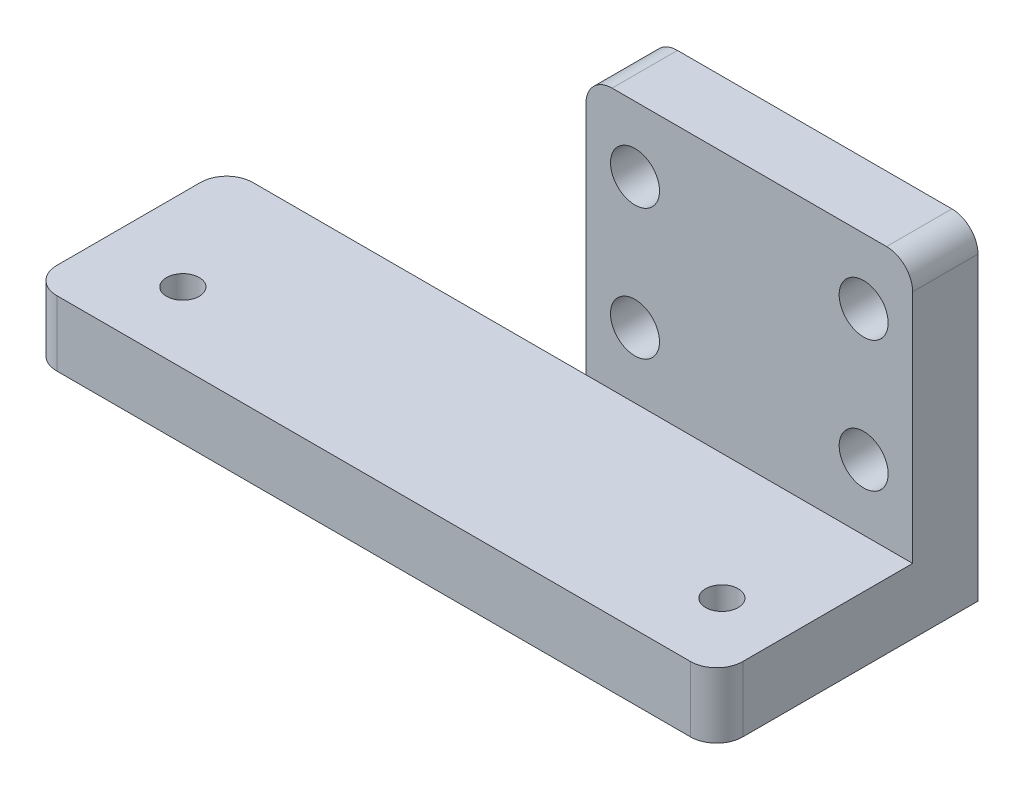
ISO-10303-21;
HEADER;
FILE_DESCRIPTION(('STEP AP214'),'2;1');
FILE_NAME('part.step','',(''),(''),'','','');
FILE_SCHEMA(('AUTOMOTIVE_DESIGN { 1 0 10303 214 1 1 1 1 }'));
ENDSEC;
DATA;
#1=APPLICATION_CONTEXT('core data for automotive mechanical design processes');
#2=APPLICATION_PROTOCOL_DEFINITION('international standard','automotive_design',2000,#1);
#3=PRODUCT_CONTEXT('',#1,'mechanical');
#4=PRODUCT('Part','Part','',(#3));
#5=PRODUCT_RELATED_PRODUCT_CATEGORY('part','',(#4));
#6=PRODUCT_DEFINITION_FORMATION('','',#4);
#7=PRODUCT_DEFINITION_CONTEXT('part definition',#1,'design');
#8=PRODUCT_DEFINITION('design','',#6,#7);
#9=PRODUCT_DEFINITION_SHAPE('','',#8);
#10=(LENGTH_UNIT() NAMED_UNIT(*) SI_UNIT(.MILLI.,.METRE.));
#11=(NAMED_UNIT(*) PLANE_ANGLE_UNIT() SI_UNIT($,.RADIAN.));
#12=(NAMED_UNIT(*) SI_UNIT($,.STERADIAN.) SOLID_ANGLE_UNIT());
#13=UNCERTAINTY_MEASURE_WITH_UNIT(LENGTH_MEASURE(1.E-05),#10,'distance_accuracy_value','');
#14=(GEOMETRIC_REPRESENTATION_CONTEXT(3) GLOBAL_UNCERTAINTY_ASSIGNED_CONTEXT((#13)) GLOBAL_UNIT_ASSIGNED_CONTEXT((#10,
#11,#12)) REPRESENTATION_CONTEXT('',''));
#15=CARTESIAN_POINT('',(0.,0.,0.));
#16=DIRECTION('',(0.,0.,1.));
#17=DIRECTION('',(1.,0.,0.));
#18=AXIS2_PLACEMENT_3D('',#15,#16,#17);
#19=CARTESIAN_POINT('',(0.,0.,6.35));
#20=DIRECTION('',(0.,0.,-1.));
#21=DIRECTION('',(-1.,0.,0.));
#22=AXIS2_PLACEMENT_3D('',#19,#20,#21);
#23=PLANE('',#22);
#24=CARTESIAN_POINT('',(11.1125,-3.175,6.35));
#25=DIRECTION('',(0.,0.,1.));
#26=DIRECTION('',(1.,0.,0.));
#27=AXIS2_PLACEMENT_3D('',#24,#25,#26);
#28=CIRCLE('',#27,2.38125);
#29=CARTESIAN_POINT('',(13.49375,-3.175,6.35));
#30=VERTEX_POINT('',#29);
#31=EDGE_CURVE('E175',#30,#30,#28,.T.);
#32=ORIENTED_EDGE('',*,*,#31,.F.);
#33=EDGE_LOOP('',(#32));
#34=FACE_BOUND('',#33,.T.);
#35=CARTESIAN_POINT('',(11.1125,9.525,6.35));
#36=DIRECTION('',(0.,0.,1.));
#37=DIRECTION('',(1.,0.,0.));
#38=AXIS2_PLACEMENT_3D('',#35,#36,#37);
#39=CIRCLE('',#38,2.38125);
#40=CARTESIAN_POINT('',(13.49375,9.525,6.35));
#41=VERTEX_POINT('',#40);
#42=EDGE_CURVE('E181',#41,#41,#39,.T.);
#43=ORIENTED_EDGE('',*,*,#42,.F.);
#44=EDGE_LOOP('',(#43));
#45=FACE_BOUND('',#44,.T.);
#46=CARTESIAN_POINT('',(-11.1125,9.525,6.35));
#47=DIRECTION('',(0.,0.,1.));
#48=DIRECTION('',(1.,0.,0.));
#49=AXIS2_PLACEMENT_3D('',#46,#47,#48);
#50=CIRCLE('',#49,2.38125);
#51=CARTESIAN_POINT('',(-8.73125,9.525,6.35));
#52=VERTEX_POINT('',#51);
#53=EDGE_CURVE('E187',#52,#52,#50,.T.);
#54=ORIENTED_EDGE('',*,*,#53,.F.);
#55=EDGE_LOOP('',(#54));
#56=FACE_BOUND('',#55,.T.);
#57=CARTESIAN_POINT('',(-11.1125,-3.175,6.35));
#58=DIRECTION('',(0.,0.,1.));
#59=DIRECTION('',(1.,0.,0.));
#60=AXIS2_PLACEMENT_3D('',#57,#58,#59);
#61=CIRCLE('',#60,2.38125);
#62=CARTESIAN_POINT('',(-8.73125,-3.175,6.35));
#63=VERTEX_POINT('',#62);
#64=EDGE_CURVE('E193',#63,#63,#61,.T.);
#65=ORIENTED_EDGE('',*,*,#64,.F.);
#66=EDGE_LOOP('',(#65));
#67=FACE_BOUND('',#66,.T.);
#68=DIRECTION('',(-1.,0.,0.));
#69=VECTOR('',#68,1.);
#70=CARTESIAN_POINT('',(-15.875,15.875,6.35));
#71=LINE('',#70,#69);
#72=CARTESIAN_POINT('',(13.335,15.875,6.35));
#73=VERTEX_POINT('',#72);
#74=CARTESIAN_POINT('',(-13.335,15.875,6.35));
#75=VERTEX_POINT('',#74);
#76=EDGE_CURVE('E149',#73,#75,#71,.T.);
#77=ORIENTED_EDGE('',*,*,#76,.T.);
#78=CARTESIAN_POINT('',(-13.335,13.335,6.35));
#79=DIRECTION('',(0.,0.,-1.));
#80=DIRECTION('',(-1.,0.,0.));
#81=AXIS2_PLACEMENT_3D('',#78,#79,#80);
#82=CIRCLE('',#81,2.54);
#83=CARTESIAN_POINT('',(-15.875,13.335,6.35));
#84=VERTEX_POINT('',#83);
#85=EDGE_CURVE('E135',#75,#84,#82,.F.);
#86=ORIENTED_EDGE('',*,*,#85,.T.);
#87=DIRECTION('',(0.,-1.,0.));
#88=VECTOR('',#87,1.);
#89=CARTESIAN_POINT('',(-15.875,-15.875,6.35));
#90=LINE('',#89,#88);
#91=CARTESIAN_POINT('',(-15.875,-9.525,6.35));
#92=VERTEX_POINT('',#91);
#93=EDGE_CURVE('E127',#84,#92,#90,.T.);
#94=ORIENTED_EDGE('',*,*,#93,.T.);
#95=DIRECTION('',(-1.,0.,0.));
#96=VECTOR('',#95,1.);
#97=CARTESIAN_POINT('',(-50.8,-9.525,6.35));
#98=LINE('',#97,#96);
#99=CARTESIAN_POINT('',(15.875,-9.525,6.35));
#100=VERTEX_POINT('',#99);
#101=EDGE_CURVE('E132',#100,#92,#98,.T.);
#102=ORIENTED_EDGE('',*,*,#101,.F.);
#103=DIRECTION('',(0.,1.,0.));
#104=VECTOR('',#103,1.);
#105=CARTESIAN_POINT('',(15.875,-15.875,6.35));
#106=LINE('',#105,#104);
#107=CARTESIAN_POINT('',(15.875,13.335,6.35));
#108=VERTEX_POINT('',#107);
#109=EDGE_CURVE('E199',#100,#108,#106,.T.);
#110=ORIENTED_EDGE('',*,*,#109,.T.);
#111=CARTESIAN_POINT('',(13.335,13.335,6.35));
#112=DIRECTION('',(0.,0.,-1.));
#113=DIRECTION('',(-1.,0.,0.));
#114=AXIS2_PLACEMENT_3D('',#111,#112,#113);
#115=CIRCLE('',#114,2.54);
#116=EDGE_CURVE('E225',#108,#73,#115,.F.);
#117=ORIENTED_EDGE('',*,*,#116,.T.);
#118=EDGE_LOOP('',(#77,#86,#94,#102,#110,#117));
#119=FACE_BOUND('',#118,.T.);
#120=ADVANCED_FACE('F36',(#34,#45,#56,#67,#119),#23,.F.);
#121=CARTESIAN_POINT('',(0.,0.,0.));
#122=DIRECTION('',(0.,0.,-1.));
#123=DIRECTION('',(-1.,0.,0.));
#124=AXIS2_PLACEMENT_3D('',#121,#122,#123);
#125=PLANE('',#124);
#126=CARTESIAN_POINT('',(11.1125,9.525,0.));
#127=DIRECTION('',(0.,0.,1.));
#128=DIRECTION('',(1.,0.,0.));
#129=AXIS2_PLACEMENT_3D('',#126,#127,#128);
#130=CIRCLE('',#129,2.38125);
#131=CARTESIAN_POINT('',(13.49375,9.525,0.));
#132=VERTEX_POINT('',#131);
#133=EDGE_CURVE('E178',#132,#132,#130,.T.);
#134=ORIENTED_EDGE('',*,*,#133,.T.);
#135=EDGE_LOOP('',(#134));
#136=FACE_BOUND('',#135,.T.);
#137=CARTESIAN_POINT('',(-11.1125,-3.175,0.));
#138=DIRECTION('',(0.,0.,1.));
#139=DIRECTION('',(1.,0.,0.));
#140=AXIS2_PLACEMENT_3D('',#137,#138,#139);
#141=CIRCLE('',#140,2.38125);
#142=CARTESIAN_POINT('',(-8.73125,-3.175,0.));
#143=VERTEX_POINT('',#142);
#144=EDGE_CURVE('E190',#143,#143,#141,.T.);
#145=ORIENTED_EDGE('',*,*,#144,.T.);
#146=EDGE_LOOP('',(#145));
#147=FACE_BOUND('',#146,.T.);
#148=DIRECTION('',(0.,-1.,0.));
#149=VECTOR('',#148,1.);
#150=CARTESIAN_POINT('',(-15.875,-15.875,0.));
#151=LINE('',#150,#149);
#152=CARTESIAN_POINT('',(-15.875,13.335,0.));
#153=VERTEX_POINT('',#152);
#154=CARTESIAN_POINT('',(-15.875,-15.875,0.));
#155=VERTEX_POINT('',#154);
#156=EDGE_CURVE('E208',#153,#155,#151,.T.);
#157=ORIENTED_EDGE('',*,*,#156,.F.);
#158=CARTESIAN_POINT('',(-13.335,13.335,0.));
#159=DIRECTION('',(0.,0.,-1.));
#160=DIRECTION('',(-1.,0.,0.));
#161=AXIS2_PLACEMENT_3D('',#158,#159,#160);
#162=CIRCLE('',#161,2.54);
#163=CARTESIAN_POINT('',(-13.335,15.875,0.));
#164=VERTEX_POINT('',#163);
#165=EDGE_CURVE('E218',#153,#164,#162,.T.);
#166=ORIENTED_EDGE('',*,*,#165,.T.);
#167=DIRECTION('',(-1.,0.,0.));
#168=VECTOR('',#167,1.);
#169=CARTESIAN_POINT('',(-15.875,15.875,0.));
#170=LINE('',#169,#168);
#171=CARTESIAN_POINT('',(13.335,15.875,0.));
#172=VERTEX_POINT('',#171);
#173=EDGE_CURVE('E205',#172,#164,#170,.T.);
#174=ORIENTED_EDGE('',*,*,#173,.F.);
#175=CARTESIAN_POINT('',(13.335,13.335,0.));
#176=DIRECTION('',(0.,0.,-1.));
#177=DIRECTION('',(-1.,0.,0.));
#178=AXIS2_PLACEMENT_3D('',#175,#176,#177);
#179=CIRCLE('',#178,2.54);
#180=CARTESIAN_POINT('',(15.875,13.335,0.));
#181=VERTEX_POINT('',#180);
#182=EDGE_CURVE('E216',#172,#181,#179,.T.);
#183=ORIENTED_EDGE('',*,*,#182,.T.);
#184=DIRECTION('',(0.,1.,0.));
#185=VECTOR('',#184,1.);
#186=CARTESIAN_POINT('',(15.875,-15.875,0.));
#187=LINE('',#186,#185);
#188=CARTESIAN_POINT('',(15.875,-15.875,0.));
#189=VERTEX_POINT('',#188);
#190=EDGE_CURVE('E196',#189,#181,#187,.T.);
#191=ORIENTED_EDGE('',*,*,#190,.F.);
#192=DIRECTION('',(1.,0.,0.));
#193=VECTOR('',#192,1.);
#194=CARTESIAN_POINT('',(-15.875,-15.875,0.));
#195=LINE('',#194,#193);
#196=EDGE_CURVE('E201',#155,#189,#195,.T.);
#197=ORIENTED_EDGE('',*,*,#196,.F.);
#198=EDGE_LOOP('',(#157,#166,#174,#183,#191,#197));
#199=FACE_BOUND('',#198,.T.);
#200=CARTESIAN_POINT('',(-11.1125,9.525,0.));
#201=DIRECTION('',(0.,0.,1.));
#202=DIRECTION('',(1.,0.,0.));
#203=AXIS2_PLACEMENT_3D('',#200,#201,#202);
#204=CIRCLE('',#203,2.38125);
#205=CARTESIAN_POINT('',(-8.73125,9.525,0.));
#206=VERTEX_POINT('',#205);
#207=EDGE_CURVE('E184',#206,#206,#204,.T.);
#208=ORIENTED_EDGE('',*,*,#207,.T.);
#209=EDGE_LOOP('',(#208));
#210=FACE_BOUND('',#209,.T.);
#211=CARTESIAN_POINT('',(11.1125,-3.175,0.));
#212=DIRECTION('',(0.,0.,1.));
#213=DIRECTION('',(1.,0.,0.));
#214=AXIS2_PLACEMENT_3D('',#211,#212,#213);
#215=CIRCLE('',#214,2.38125);
#216=CARTESIAN_POINT('',(13.49375,-3.175,0.));
#217=VERTEX_POINT('',#216);
#218=EDGE_CURVE('E174',#217,#217,#215,.T.);
#219=ORIENTED_EDGE('',*,*,#218,.T.);
#220=EDGE_LOOP('',(#219));
#221=FACE_BOUND('',#220,.T.);
#222=ADVANCED_FACE('F291',(#136,#147,#199,#210,#221),#125,.T.);
#223=CARTESIAN_POINT('',(15.875,-15.875,6.35));
#224=DIRECTION('',(-1.,0.,0.));
#225=DIRECTION('',(0.,0.,1.));
#226=AXIS2_PLACEMENT_3D('',#223,#224,#225);
#227=PLANE('',#226);
#228=ORIENTED_EDGE('',*,*,#190,.T.);
#229=DIRECTION('',(0.,0.,-1.));
#230=VECTOR('',#229,1.);
#231=CARTESIAN_POINT('',(15.875,13.335,6.35));
#232=LINE('',#231,#230);
#233=EDGE_CURVE('E230',#181,#108,#232,.F.);
#234=ORIENTED_EDGE('',*,*,#233,.T.);
#235=ORIENTED_EDGE('',*,*,#109,.F.);
#236=DIRECTION('',(0.,0.,-1.));
#237=VECTOR('',#236,1.);
#238=CARTESIAN_POINT('',(15.875,-9.525,25.4));
#239=LINE('',#238,#237);
#240=CARTESIAN_POINT('',(15.875,-9.525,22.86));
#241=VERTEX_POINT('',#240);
#242=EDGE_CURVE('E160',#241,#100,#239,.T.);
#243=ORIENTED_EDGE('',*,*,#242,.F.);
#244=DIRECTION('',(0.,1.,0.));
#245=VECTOR('',#244,1.);
#246=CARTESIAN_POINT('',(15.875,-15.875,22.86));
#247=LINE('',#246,#245);
#248=CARTESIAN_POINT('',(15.875,-15.875,22.86));
#249=VERTEX_POINT('',#248);
#250=EDGE_CURVE('E228',#241,#249,#247,.F.);
#251=ORIENTED_EDGE('',*,*,#250,.T.);
#252=DIRECTION('',(0.,0.,-1.));
#253=VECTOR('',#252,1.);
#254=CARTESIAN_POINT('',(15.875,-15.875,6.35));
#255=LINE('',#254,#253);
#256=EDGE_CURVE('E139',#249,#189,#255,.T.);
#257=ORIENTED_EDGE('',*,*,#256,.T.);
#258=EDGE_LOOP('',(#228,#234,#235,#243,#251,#257));
#259=FACE_BOUND('',#258,.T.);
#260=ADVANCED_FACE('F297',(#259),#227,.F.);
#261=CARTESIAN_POINT('',(-15.875,15.875,6.35));
#262=DIRECTION('',(0.,-1.,0.));
#263=DIRECTION('',(0.,0.,-1.));
#264=AXIS2_PLACEMENT_3D('',#261,#262,#263);
#265=PLANE('',#264);
#266=ORIENTED_EDGE('',*,*,#173,.T.);
#267=DIRECTION('',(0.,0.,-1.));
#268=VECTOR('',#267,1.);
#269=CARTESIAN_POINT('',(-13.335,15.875,6.35));
#270=LINE('',#269,#268);
#271=EDGE_CURVE('E223',#164,#75,#270,.F.);
#272=ORIENTED_EDGE('',*,*,#271,.T.);
#273=ORIENTED_EDGE('',*,*,#76,.F.);
#274=DIRECTION('',(0.,0.,-1.));
#275=VECTOR('',#274,1.);
#276=CARTESIAN_POINT('',(13.335,15.875,6.35));
#277=LINE('',#276,#275);
#278=EDGE_CURVE('E220',#73,#172,#277,.T.);
#279=ORIENTED_EDGE('',*,*,#278,.T.);
#280=EDGE_LOOP('',(#266,#272,#273,#279));
#281=FACE_BOUND('',#280,.T.);
#282=ADVANCED_FACE('F310',(#281),#265,.F.);
#283=CARTESIAN_POINT('',(-15.875,-15.875,6.35));
#284=DIRECTION('',(1.,0.,0.));
#285=DIRECTION('',(0.,0.,-1.));
#286=AXIS2_PLACEMENT_3D('',#283,#284,#285);
#287=PLANE('',#286);
#288=ORIENTED_EDGE('',*,*,#93,.F.);
#289=DIRECTION('',(0.,0.,-1.));
#290=VECTOR('',#289,1.);
#291=CARTESIAN_POINT('',(-15.875,13.335,6.35));
#292=LINE('',#291,#290);
#293=EDGE_CURVE('E214',#84,#153,#292,.T.);
#294=ORIENTED_EDGE('',*,*,#293,.T.);
#295=ORIENTED_EDGE('',*,*,#156,.T.);
#296=DIRECTION('',(0.,0.,-1.));
#297=VECTOR('',#296,1.);
#298=CARTESIAN_POINT('',(-15.875,-15.875,6.35));
#299=LINE('',#298,#297);
#300=CARTESIAN_POINT('',(-15.875,-15.875,6.35));
#301=VERTEX_POINT('',#300);
#302=EDGE_CURVE('E147',#301,#155,#299,.T.);
#303=ORIENTED_EDGE('',*,*,#302,.F.);
#304=EDGE_CURVE('E140',#92,#301,#90,.T.);
#305=ORIENTED_EDGE('',*,*,#304,.F.);
#306=EDGE_LOOP('',(#288,#294,#295,#303,#305));
#307=FACE_BOUND('',#306,.T.);
#308=ADVANCED_FACE('F145',(#307),#287,.F.);
#309=CARTESIAN_POINT('',(-15.875,-15.875,6.35));
#310=DIRECTION('',(0.,1.,0.));
#311=DIRECTION('',(0.,0.,1.));
#312=AXIS2_PLACEMENT_3D('',#309,#310,#311);
#313=PLANE('',#312);
#314=CARTESIAN_POINT('',(9.525,-15.875,18.542));
#315=DIRECTION('',(0.,1.,0.));
#316=DIRECTION('',(0.,0.,1.));
#317=AXIS2_PLACEMENT_3D('',#314,#315,#316);
#318=CIRCLE('',#317,1.5875);
#319=CARTESIAN_POINT('',(9.525,-15.875,20.1295));
#320=VERTEX_POINT('',#319);
#321=EDGE_CURVE('E275',#320,#320,#318,.T.);
#322=ORIENTED_EDGE('',*,*,#321,.T.);
#323=EDGE_LOOP('',(#322));
#324=FACE_BOUND('',#323,.T.);
#325=CARTESIAN_POINT('',(-42.8625,-15.875,18.542));
#326=DIRECTION('',(0.,1.,0.));
#327=DIRECTION('',(0.,0.,1.));
#328=AXIS2_PLACEMENT_3D('',#325,#326,#327);
#329=CIRCLE('',#328,1.5875);
#330=CARTESIAN_POINT('',(-42.8625,-15.875,20.1295));
#331=VERTEX_POINT('',#330);
#332=EDGE_CURVE('E269',#331,#331,#329,.T.);
#333=ORIENTED_EDGE('',*,*,#332,.T.);
#334=EDGE_LOOP('',(#333));
#335=FACE_BOUND('',#334,.T.);
#336=ORIENTED_EDGE('',*,*,#256,.F.);
#337=CARTESIAN_POINT('',(13.335,-15.875,22.86));
#338=DIRECTION('',(0.,1.,0.));
#339=DIRECTION('',(0.,0.,1.));
#340=AXIS2_PLACEMENT_3D('',#337,#338,#339);
#341=CIRCLE('',#340,2.54);
#342=CARTESIAN_POINT('',(13.335,-15.875,25.4));
#343=VERTEX_POINT('',#342);
#344=EDGE_CURVE('E247',#249,#343,#341,.F.);
#345=ORIENTED_EDGE('',*,*,#344,.T.);
#346=DIRECTION('',(1.,0.,0.));
#347=VECTOR('',#346,1.);
#348=CARTESIAN_POINT('',(-50.8,-15.875,25.4));
#349=LINE('',#348,#347);
#350=CARTESIAN_POINT('',(-48.26,-15.875,25.4));
#351=VERTEX_POINT('',#350);
#352=EDGE_CURVE('E161',#351,#343,#349,.T.);
#353=ORIENTED_EDGE('',*,*,#352,.F.);
#354=CARTESIAN_POINT('',(-48.26,-15.875,22.86));
#355=DIRECTION('',(0.,1.,0.));
#356=DIRECTION('',(0.,0.,1.));
#357=AXIS2_PLACEMENT_3D('',#354,#355,#356);
#358=CIRCLE('',#357,2.54);
#359=CARTESIAN_POINT('',(-50.8,-15.875,22.86));
#360=VERTEX_POINT('',#359);
#361=EDGE_CURVE('E244',#351,#360,#358,.F.);
#362=ORIENTED_EDGE('',*,*,#361,.T.);
#363=DIRECTION('',(0.,0.,-1.));
#364=VECTOR('',#363,1.);
#365=CARTESIAN_POINT('',(-50.8,-15.875,25.4));
#366=LINE('',#365,#364);
#367=CARTESIAN_POINT('',(-50.8,-15.875,8.89000000000001));
#368=VERTEX_POINT('',#367);
#369=EDGE_CURVE('E172',#360,#368,#366,.T.);
#370=ORIENTED_EDGE('',*,*,#369,.T.);
#371=CARTESIAN_POINT('',(-48.26,-15.875,8.89));
#372=DIRECTION('',(0.,1.,0.));
#373=DIRECTION('',(0.,0.,1.));
#374=AXIS2_PLACEMENT_3D('',#371,#372,#373);
#375=CIRCLE('',#374,2.54);
#376=CARTESIAN_POINT('',(-48.26,-15.875,6.35));
#377=VERTEX_POINT('',#376);
#378=EDGE_CURVE('E51',#368,#377,#375,.F.);
#379=ORIENTED_EDGE('',*,*,#378,.T.);
#380=DIRECTION('',(1.,0.,0.));
#381=VECTOR('',#380,1.);
#382=CARTESIAN_POINT('',(-50.8,-15.875,6.35));
#383=LINE('',#382,#381);
#384=EDGE_CURVE('E155',#377,#301,#383,.T.);
#385=ORIENTED_EDGE('',*,*,#384,.T.);
#386=ORIENTED_EDGE('',*,*,#302,.T.);
#387=ORIENTED_EDGE('',*,*,#196,.T.);
#388=EDGE_LOOP('',(#336,#345,#353,#362,#370,#379,#385,#386,#387));
#389=FACE_BOUND('',#388,.T.);
#390=ADVANCED_FACE('F256',(#324,#335,#389),#313,.F.);
#391=CARTESIAN_POINT('',(-11.1125,-3.175,6.35));
#392=DIRECTION('',(0.,0.,-1.));
#393=DIRECTION('',(-1.,0.,0.));
#394=AXIS2_PLACEMENT_3D('',#391,#392,#393);
#395=CYLINDRICAL_SURFACE('',#394,2.38125);
#396=ORIENTED_EDGE('',*,*,#64,.T.);
#397=EDGE_LOOP('',(#396));
#398=FACE_BOUND('',#397,.T.);
#399=ORIENTED_EDGE('',*,*,#144,.F.);
#400=EDGE_LOOP('',(#399));
#401=FACE_BOUND('',#400,.T.);
#402=ADVANCED_FACE('F303',(#398,#401),#395,.F.);
#403=CARTESIAN_POINT('',(-11.1125,9.525,6.35));
#404=DIRECTION('',(0.,0.,-1.));
#405=DIRECTION('',(-1.,0.,0.));
#406=AXIS2_PLACEMENT_3D('',#403,#404,#405);
#407=CYLINDRICAL_SURFACE('',#406,2.38125);
#408=ORIENTED_EDGE('',*,*,#53,.T.);
#409=EDGE_LOOP('',(#408));
#410=FACE_BOUND('',#409,.T.);
#411=ORIENTED_EDGE('',*,*,#207,.F.);
#412=EDGE_LOOP('',(#411));
#413=FACE_BOUND('',#412,.T.);
#414=ADVANCED_FACE('F352',(#410,#413),#407,.F.);
#415=CARTESIAN_POINT('',(11.1125,9.525,6.35));
#416=DIRECTION('',(0.,0.,-1.));
#417=DIRECTION('',(-1.,0.,0.));
#418=AXIS2_PLACEMENT_3D('',#415,#416,#417);
#419=CYLINDRICAL_SURFACE('',#418,2.38125);
#420=ORIENTED_EDGE('',*,*,#42,.T.);
#421=EDGE_LOOP('',(#420));
#422=FACE_BOUND('',#421,.T.);
#423=ORIENTED_EDGE('',*,*,#133,.F.);
#424=EDGE_LOOP('',(#423));
#425=FACE_BOUND('',#424,.T.);
#426=ADVANCED_FACE('F344',(#422,#425),#419,.F.);
#427=CARTESIAN_POINT('',(11.1125,-3.175,6.35));
#428=DIRECTION('',(0.,0.,-1.));
#429=DIRECTION('',(-1.,0.,0.));
#430=AXIS2_PLACEMENT_3D('',#427,#428,#429);
#431=CYLINDRICAL_SURFACE('',#430,2.38125);
#432=ORIENTED_EDGE('',*,*,#31,.T.);
#433=EDGE_LOOP('',(#432));
#434=FACE_BOUND('',#433,.T.);
#435=ORIENTED_EDGE('',*,*,#218,.F.);
#436=EDGE_LOOP('',(#435));
#437=FACE_BOUND('',#436,.T.);
#438=ADVANCED_FACE('F342',(#434,#437),#431,.F.);
#439=CARTESIAN_POINT('',(-50.8,-15.875,25.4));
#440=DIRECTION('',(1.,0.,0.));
#441=DIRECTION('',(0.,0.,-1.));
#442=AXIS2_PLACEMENT_3D('',#439,#440,#441);
#443=PLANE('',#442);
#444=DIRECTION('',(0.,0.,-1.));
#445=VECTOR('',#444,1.);
#446=CARTESIAN_POINT('',(-50.8,-9.525,25.4));
#447=LINE('',#446,#445);
#448=CARTESIAN_POINT('',(-50.8,-9.525,22.86));
#449=VERTEX_POINT('',#448);
#450=CARTESIAN_POINT('',(-50.8,-9.525,8.89000000000001));
#451=VERTEX_POINT('',#450);
#452=EDGE_CURVE('E168',#449,#451,#447,.T.);
#453=ORIENTED_EDGE('',*,*,#452,.T.);
#454=DIRECTION('',(0.,-1.,0.));
#455=VECTOR('',#454,1.);
#456=CARTESIAN_POINT('',(-50.8,-15.875,8.89));
#457=LINE('',#456,#455);
#458=EDGE_CURVE('E44',#451,#368,#457,.T.);
#459=ORIENTED_EDGE('',*,*,#458,.T.);
#460=ORIENTED_EDGE('',*,*,#369,.F.);
#461=DIRECTION('',(0.,-1.,0.));
#462=VECTOR('',#461,1.);
#463=CARTESIAN_POINT('',(-50.8,-15.875,22.86));
#464=LINE('',#463,#462);
#465=EDGE_CURVE('E249',#360,#449,#464,.F.);
#466=ORIENTED_EDGE('',*,*,#465,.T.);
#467=EDGE_LOOP('',(#453,#459,#460,#466));
#468=FACE_BOUND('',#467,.T.);
#469=ADVANCED_FACE('F252',(#468),#443,.F.);
#470=CARTESIAN_POINT('',(-50.8,-9.525,25.4));
#471=DIRECTION('',(0.,-1.,0.));
#472=DIRECTION('',(0.,0.,-1.));
#473=AXIS2_PLACEMENT_3D('',#470,#471,#472);
#474=PLANE('',#473);
#475=CARTESIAN_POINT('',(9.525,-9.525,18.542));
#476=DIRECTION('',(0.,1.,0.));
#477=DIRECTION('',(0.,0.,1.));
#478=AXIS2_PLACEMENT_3D('',#475,#476,#477);
#479=CIRCLE('',#478,1.5875);
#480=CARTESIAN_POINT('',(9.525,-9.525,20.1295));
#481=VERTEX_POINT('',#480);
#482=EDGE_CURVE('E272',#481,#481,#479,.T.);
#483=ORIENTED_EDGE('',*,*,#482,.F.);
#484=EDGE_LOOP('',(#483));
#485=FACE_BOUND('',#484,.T.);
#486=CARTESIAN_POINT('',(-42.8625,-9.525,18.542));
#487=DIRECTION('',(0.,1.,0.));
#488=DIRECTION('',(0.,0.,1.));
#489=AXIS2_PLACEMENT_3D('',#486,#487,#488);
#490=CIRCLE('',#489,1.5875);
#491=CARTESIAN_POINT('',(-42.8625,-9.525,20.1295));
#492=VERTEX_POINT('',#491);
#493=EDGE_CURVE('E266',#492,#492,#490,.T.);
#494=ORIENTED_EDGE('',*,*,#493,.F.);
#495=EDGE_LOOP('',(#494));
#496=FACE_BOUND('',#495,.T.);
#497=DIRECTION('',(-1.,0.,0.));
#498=VECTOR('',#497,1.);
#499=CARTESIAN_POINT('',(-50.8,-9.525,25.4));
#500=LINE('',#499,#498);
#501=CARTESIAN_POINT('',(13.335,-9.525,25.4));
#502=VERTEX_POINT('',#501);
#503=CARTESIAN_POINT('',(-48.26,-9.525,25.4));
#504=VERTEX_POINT('',#503);
#505=EDGE_CURVE('E163',#502,#504,#500,.T.);
#506=ORIENTED_EDGE('',*,*,#505,.F.);
#507=CARTESIAN_POINT('',(13.335,-9.525,22.86));
#508=DIRECTION('',(0.,-1.,0.));
#509=DIRECTION('',(0.,0.,-1.));
#510=AXIS2_PLACEMENT_3D('',#507,#508,#509);
#511=CIRCLE('',#510,2.54);
#512=EDGE_CURVE('E242',#502,#241,#511,.F.);
#513=ORIENTED_EDGE('',*,*,#512,.T.);
#514=ORIENTED_EDGE('',*,*,#242,.T.);
#515=ORIENTED_EDGE('',*,*,#101,.T.);
#516=CARTESIAN_POINT('',(-48.26,-9.525,6.35));
#517=VERTEX_POINT('',#516);
#518=EDGE_CURVE('E151',#92,#517,#98,.T.);
#519=ORIENTED_EDGE('',*,*,#518,.T.);
#520=CARTESIAN_POINT('',(-48.26,-9.525,8.89));
#521=DIRECTION('',(0.,-1.,0.));
#522=DIRECTION('',(0.,0.,-1.));
#523=AXIS2_PLACEMENT_3D('',#520,#521,#522);
#524=CIRCLE('',#523,2.54);
#525=EDGE_CURVE('E240',#517,#451,#524,.F.);
#526=ORIENTED_EDGE('',*,*,#525,.T.);
#527=ORIENTED_EDGE('',*,*,#452,.F.);
#528=CARTESIAN_POINT('',(-48.26,-9.525,22.86));
#529=DIRECTION('',(0.,-1.,0.));
#530=DIRECTION('',(0.,0.,-1.));
#531=AXIS2_PLACEMENT_3D('',#528,#529,#530);
#532=CIRCLE('',#531,2.54);
#533=EDGE_CURVE('E238',#449,#504,#532,.F.);
#534=ORIENTED_EDGE('',*,*,#533,.T.);
#535=EDGE_LOOP('',(#506,#513,#514,#515,#519,#526,#527,#534));
#536=FACE_BOUND('',#535,.T.);
#537=ADVANCED_FACE('F158',(#485,#496,#536),#474,.F.);
#538=CARTESIAN_POINT('',(0.,0.,25.4));
#539=DIRECTION('',(0.,0.,-1.));
#540=DIRECTION('',(-1.,0.,0.));
#541=AXIS2_PLACEMENT_3D('',#538,#539,#540);
#542=PLANE('',#541);
#543=ORIENTED_EDGE('',*,*,#352,.T.);
#544=DIRECTION('',(0.,1.,0.));
#545=VECTOR('',#544,1.);
#546=CARTESIAN_POINT('',(13.335,0.,25.4));
#547=LINE('',#546,#545);
#548=EDGE_CURVE('E235',#343,#502,#547,.T.);
#549=ORIENTED_EDGE('',*,*,#548,.T.);
#550=ORIENTED_EDGE('',*,*,#505,.T.);
#551=DIRECTION('',(0.,-1.,0.));
#552=VECTOR('',#551,1.);
#553=CARTESIAN_POINT('',(-48.26,0.,25.4));
#554=LINE('',#553,#552);
#555=EDGE_CURVE('E232',#504,#351,#554,.T.);
#556=ORIENTED_EDGE('',*,*,#555,.T.);
#557=EDGE_LOOP('',(#543,#549,#550,#556));
#558=FACE_BOUND('',#557,.T.);
#559=ADVANCED_FACE('F263',(#558),#542,.F.);
#560=CARTESIAN_POINT('',(0.,0.,6.35));
#561=DIRECTION('',(0.,0.,-1.));
#562=DIRECTION('',(-1.,0.,0.));
#563=AXIS2_PLACEMENT_3D('',#560,#561,#562);
#564=PLANE('',#563);
#565=ORIENTED_EDGE('',*,*,#384,.F.);
#566=DIRECTION('',(0.,-1.,0.));
#567=VECTOR('',#566,1.);
#568=CARTESIAN_POINT('',(-48.26,-9.525,6.35));
#569=LINE('',#568,#567);
#570=EDGE_CURVE('E11',#377,#517,#569,.F.);
#571=ORIENTED_EDGE('',*,*,#570,.T.);
#572=ORIENTED_EDGE('',*,*,#518,.F.);
#573=ORIENTED_EDGE('',*,*,#304,.T.);
#574=EDGE_LOOP('',(#565,#571,#572,#573));
#575=FACE_BOUND('',#574,.T.);
#576=ADVANCED_FACE('F152',(#575),#564,.T.);
#577=CARTESIAN_POINT('',(-42.8625,-15.875,18.542));
#578=DIRECTION('',(0.,1.,0.));
#579=DIRECTION('',(0.,0.,1.));
#580=AXIS2_PLACEMENT_3D('',#577,#578,#579);
#581=CYLINDRICAL_SURFACE('',#580,1.5875);
#582=ORIENTED_EDGE('',*,*,#332,.F.);
#583=EDGE_LOOP('',(#582));
#584=FACE_BOUND('',#583,.T.);
#585=ORIENTED_EDGE('',*,*,#493,.T.);
#586=EDGE_LOOP('',(#585));
#587=FACE_BOUND('',#586,.T.);
#588=ADVANCED_FACE('F408',(#584,#587),#581,.F.);
#589=CARTESIAN_POINT('',(9.525,-15.875,18.542));
#590=DIRECTION('',(0.,1.,0.));
#591=DIRECTION('',(0.,0.,1.));
#592=AXIS2_PLACEMENT_3D('',#589,#590,#591);
#593=CYLINDRICAL_SURFACE('',#592,1.5875);
#594=ORIENTED_EDGE('',*,*,#321,.F.);
#595=EDGE_LOOP('',(#594));
#596=FACE_BOUND('',#595,.T.);
#597=ORIENTED_EDGE('',*,*,#482,.T.);
#598=EDGE_LOOP('',(#597));
#599=FACE_BOUND('',#598,.T.);
#600=ADVANCED_FACE('F320',(#596,#599),#593,.F.);
#601=CARTESIAN_POINT('',(-13.335,13.335,6.35));
#602=DIRECTION('',(0.,0.,-1.));
#603=DIRECTION('',(-1.,0.,0.));
#604=AXIS2_PLACEMENT_3D('',#601,#602,#603);
#605=CYLINDRICAL_SURFACE('',#604,2.54);
#606=ORIENTED_EDGE('',*,*,#85,.F.);
#607=ORIENTED_EDGE('',*,*,#271,.F.);
#608=ORIENTED_EDGE('',*,*,#165,.F.);
#609=ORIENTED_EDGE('',*,*,#293,.F.);
#610=EDGE_LOOP('',(#606,#607,#608,#609));
#611=FACE_BOUND('',#610,.T.);
#612=ADVANCED_FACE('F317',(#611),#605,.T.);
#613=CARTESIAN_POINT('',(13.335,13.335,6.35));
#614=DIRECTION('',(0.,0.,-1.));
#615=DIRECTION('',(-1.,0.,0.));
#616=AXIS2_PLACEMENT_3D('',#613,#614,#615);
#617=CYLINDRICAL_SURFACE('',#616,2.54);
#618=ORIENTED_EDGE('',*,*,#116,.F.);
#619=ORIENTED_EDGE('',*,*,#233,.F.);
#620=ORIENTED_EDGE('',*,*,#182,.F.);
#621=ORIENTED_EDGE('',*,*,#278,.F.);
#622=EDGE_LOOP('',(#618,#619,#620,#621));
#623=FACE_BOUND('',#622,.T.);
#624=ADVANCED_FACE('F287',(#623),#617,.T.);
#625=CARTESIAN_POINT('',(13.335,0.,22.86));
#626=DIRECTION('',(0.,1.,0.));
#627=DIRECTION('',(0.,0.,1.));
#628=AXIS2_PLACEMENT_3D('',#625,#626,#627);
#629=CYLINDRICAL_SURFACE('',#628,2.54);
#630=ORIENTED_EDGE('',*,*,#344,.F.);
#631=ORIENTED_EDGE('',*,*,#250,.F.);
#632=ORIENTED_EDGE('',*,*,#512,.F.);
#633=ORIENTED_EDGE('',*,*,#548,.F.);
#634=EDGE_LOOP('',(#630,#631,#632,#633));
#635=FACE_BOUND('',#634,.T.);
#636=ADVANCED_FACE('F282',(#635),#629,.T.);
#637=CARTESIAN_POINT('',(-48.26,-15.875,8.89));
#638=DIRECTION('',(0.,1.,0.));
#639=DIRECTION('',(0.,0.,1.));
#640=AXIS2_PLACEMENT_3D('',#637,#638,#639);
#641=CYLINDRICAL_SURFACE('',#640,2.54);
#642=ORIENTED_EDGE('',*,*,#525,.F.);
#643=ORIENTED_EDGE('',*,*,#570,.F.);
#644=ORIENTED_EDGE('',*,*,#378,.F.);
#645=ORIENTED_EDGE('',*,*,#458,.F.);
#646=EDGE_LOOP('',(#642,#643,#644,#645));
#647=FACE_BOUND('',#646,.T.);
#648=ADVANCED_FACE('F280',(#647),#641,.T.);
#649=CARTESIAN_POINT('',(-48.26,0.,22.86));
#650=DIRECTION('',(0.,-1.,0.));
#651=DIRECTION('',(0.,0.,-1.));
#652=AXIS2_PLACEMENT_3D('',#649,#650,#651);
#653=CYLINDRICAL_SURFACE('',#652,2.54);
#654=ORIENTED_EDGE('',*,*,#533,.F.);
#655=ORIENTED_EDGE('',*,*,#465,.F.);
#656=ORIENTED_EDGE('',*,*,#361,.F.);
#657=ORIENTED_EDGE('',*,*,#555,.F.);
#658=EDGE_LOOP('',(#654,#655,#656,#657));
#659=FACE_BOUND('',#658,.T.);
#660=ADVANCED_FACE('F38',(#659),#653,.T.);
#661=CLOSED_SHELL('',(#120,#222,#260,#282,#308,#390,#402,#414,#426,#438,#469,#537,#559,#576,
#588,#600,#612,#624,#636,#648,#660));
#662=MANIFOLD_SOLID_BREP('B2',#661);
#663=ADVANCED_BREP_SHAPE_REPRESENTATION('',(#18,#662),#14);
#664=SHAPE_DEFINITION_REPRESENTATION(#9,#663);
ENDSEC;
END-ISO-10303-21;
